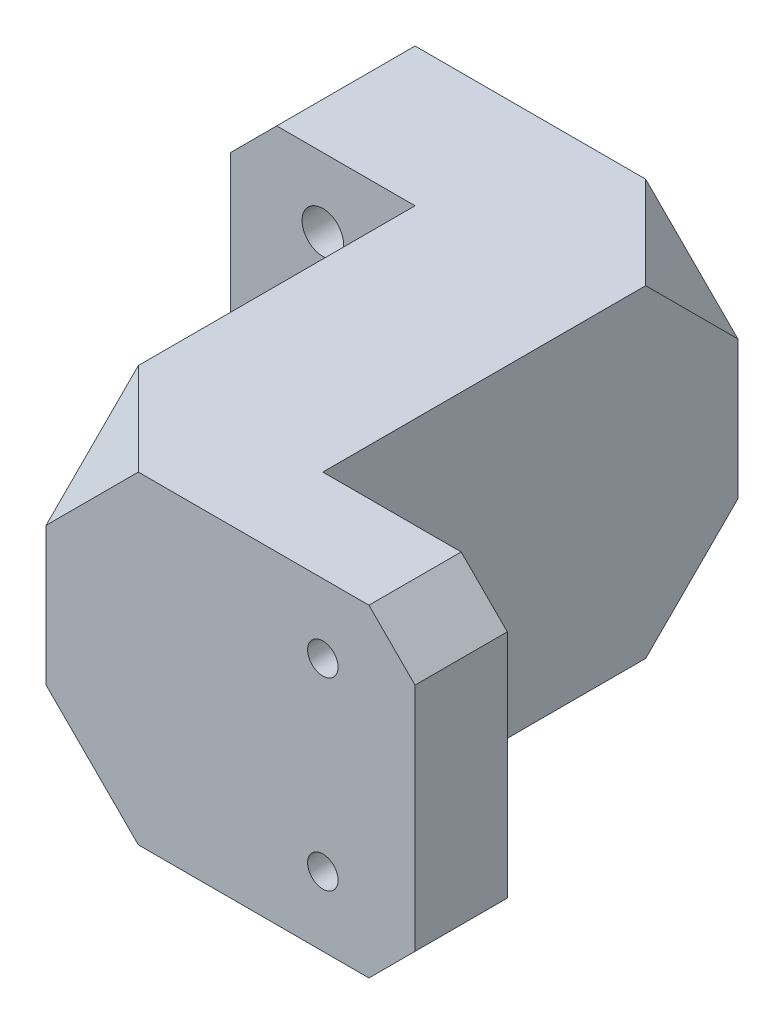
ISO-10303-21;
HEADER;
FILE_DESCRIPTION(('STEP AP214'),'2;1');
FILE_NAME('part.step','',(''),(''),'','','');
FILE_SCHEMA(('AUTOMOTIVE_DESIGN { 1 0 10303 214 1 1 1 1 }'));
ENDSEC;
DATA;
#1=APPLICATION_CONTEXT('core data for automotive mechanical design processes');
#2=APPLICATION_PROTOCOL_DEFINITION('international standard','automotive_design',2000,#1);
#3=PRODUCT_CONTEXT('',#1,'mechanical');
#4=PRODUCT('Part','Part','',(#3));
#5=PRODUCT_RELATED_PRODUCT_CATEGORY('part','',(#4));
#6=PRODUCT_DEFINITION_FORMATION('','',#4);
#7=PRODUCT_DEFINITION_CONTEXT('part definition',#1,'design');
#8=PRODUCT_DEFINITION('design','',#6,#7);
#9=PRODUCT_DEFINITION_SHAPE('','',#8);
#10=(LENGTH_UNIT() NAMED_UNIT(*) SI_UNIT(.MILLI.,.METRE.));
#11=(NAMED_UNIT(*) PLANE_ANGLE_UNIT() SI_UNIT($,.RADIAN.));
#12=(NAMED_UNIT(*) SI_UNIT($,.STERADIAN.) SOLID_ANGLE_UNIT());
#13=UNCERTAINTY_MEASURE_WITH_UNIT(LENGTH_MEASURE(1.E-05),#10,'distance_accuracy_value','');
#14=(GEOMETRIC_REPRESENTATION_CONTEXT(3) GLOBAL_UNCERTAINTY_ASSIGNED_CONTEXT((#13)) GLOBAL_UNIT_ASSIGNED_CONTEXT((#10,
#11,#12)) REPRESENTATION_CONTEXT('',''));
#15=CARTESIAN_POINT('',(0.,0.,0.));
#16=DIRECTION('',(0.,0.,1.));
#17=DIRECTION('',(1.,0.,0.));
#18=AXIS2_PLACEMENT_3D('',#15,#16,#17);
#19=CARTESIAN_POINT('',(0.,17.5,0.));
#20=DIRECTION('',(0.,1.,0.));
#21=DIRECTION('',(0.,0.,1.));
#22=AXIS2_PLACEMENT_3D('',#19,#20,#21);
#23=PLANE('',#22);
#24=DIRECTION('',(0.,0.,-1.));
#25=VECTOR('',#24,1.);
#26=CARTESIAN_POINT('',(-10.,17.5,-12.5));
#27=LINE('',#26,#25);
#28=CARTESIAN_POINT('',(-10.,17.5,17.5));
#29=VERTEX_POINT('',#28);
#30=CARTESIAN_POINT('',(-10.,17.5,-12.5));
#31=VERTEX_POINT('',#30);
#32=EDGE_CURVE('E176',#29,#31,#27,.T.);
#33=ORIENTED_EDGE('',*,*,#32,.F.);
#34=DIRECTION('',(0.707106781186548,0.,0.707106781186548));
#35=VECTOR('',#34,1.);
#36=CARTESIAN_POINT('',(-13.75,17.5,13.75));
#37=LINE('',#36,#35);
#38=CARTESIAN_POINT('',(0.,17.5,27.5));
#39=VERTEX_POINT('',#38);
#40=EDGE_CURVE('E65',#29,#39,#37,.T.);
#41=ORIENTED_EDGE('',*,*,#40,.T.);
#42=DIRECTION('',(1.,0.,0.));
#43=VECTOR('',#42,1.);
#44=CARTESIAN_POINT('',(30.,17.5,27.5));
#45=LINE('',#44,#43);
#46=CARTESIAN_POINT('',(25.,17.5,27.5));
#47=VERTEX_POINT('',#46);
#48=EDGE_CURVE('E173',#39,#47,#45,.T.);
#49=ORIENTED_EDGE('',*,*,#48,.T.);
#50=DIRECTION('',(0.,0.,-1.));
#51=VECTOR('',#50,1.);
#52=CARTESIAN_POINT('',(25.,17.5,17.5));
#53=LINE('',#52,#51);
#54=CARTESIAN_POINT('',(25.,17.5,17.5));
#55=VERTEX_POINT('',#54);
#56=EDGE_CURVE('E248',#47,#55,#53,.T.);
#57=ORIENTED_EDGE('',*,*,#56,.T.);
#58=DIRECTION('',(1.,0.,0.));
#59=VECTOR('',#58,1.);
#60=CARTESIAN_POINT('',(30.,17.5,17.5));
#61=LINE('',#60,#59);
#62=CARTESIAN_POINT('',(10.,17.5,17.5));
#63=VERTEX_POINT('',#62);
#64=EDGE_CURVE('E328',#63,#55,#61,.T.);
#65=ORIENTED_EDGE('',*,*,#64,.F.);
#66=DIRECTION('',(0.,0.,1.));
#67=VECTOR('',#66,1.);
#68=CARTESIAN_POINT('',(9.99999999999999,17.5,-27.5));
#69=LINE('',#68,#67);
#70=CARTESIAN_POINT('',(9.99999999999999,17.5,-17.5));
#71=VERTEX_POINT('',#70);
#72=EDGE_CURVE('E325',#71,#63,#69,.T.);
#73=ORIENTED_EDGE('',*,*,#72,.F.);
#74=DIRECTION('',(-0.707106781186548,0.,-0.707106781186548));
#75=VECTOR('',#74,1.);
#76=CARTESIAN_POINT('',(13.75,17.5,-13.75));
#77=LINE('',#76,#75);
#78=CARTESIAN_POINT('',(0.,17.5,-27.5));
#79=VERTEX_POINT('',#78);
#80=EDGE_CURVE('E73',#71,#79,#77,.T.);
#81=ORIENTED_EDGE('',*,*,#80,.T.);
#82=DIRECTION('',(-1.,0.,0.));
#83=VECTOR('',#82,1.);
#84=CARTESIAN_POINT('',(30.,17.5,-27.5));
#85=LINE('',#84,#83);
#86=CARTESIAN_POINT('',(-25.,17.5,-27.5));
#87=VERTEX_POINT('',#86);
#88=EDGE_CURVE('E185',#79,#87,#85,.T.);
#89=ORIENTED_EDGE('',*,*,#88,.T.);
#90=DIRECTION('',(0.,0.,1.));
#91=VECTOR('',#90,1.);
#92=CARTESIAN_POINT('',(-25.,17.5,-12.5));
#93=LINE('',#92,#91);
#94=CARTESIAN_POINT('',(-25.,17.5,-12.5));
#95=VERTEX_POINT('',#94);
#96=EDGE_CURVE('E251',#87,#95,#93,.T.);
#97=ORIENTED_EDGE('',*,*,#96,.T.);
#98=DIRECTION('',(-1.,0.,0.));
#99=VECTOR('',#98,1.);
#100=CARTESIAN_POINT('',(-30.,17.5,-12.5));
#101=LINE('',#100,#99);
#102=EDGE_CURVE('E320',#31,#95,#101,.T.);
#103=ORIENTED_EDGE('',*,*,#102,.F.);
#104=EDGE_LOOP('',(#33,#41,#49,#57,#65,#73,#81,#89,#97,#103));
#105=FACE_BOUND('',#104,.T.);
#106=ADVANCED_FACE('F48',(#105),#23,.T.);
#107=CARTESIAN_POINT('',(30.,17.5,27.5));
#108=DIRECTION('',(0.,0.,-1.));
#109=DIRECTION('',(-1.,0.,0.));
#110=AXIS2_PLACEMENT_3D('',#107,#108,#109);
#111=PLANE('',#110);
#112=CARTESIAN_POINT('',(20.,-10.,27.5));
#113=DIRECTION('',(0.,0.,-1.));
#114=DIRECTION('',(-1.,0.,0.));
#115=AXIS2_PLACEMENT_3D('',#112,#113,#114);
#116=CIRCLE('',#115,1.65);
#117=CARTESIAN_POINT('',(18.35,-10.,27.5));
#118=VERTEX_POINT('',#117);
#119=EDGE_CURVE('E319',#118,#118,#116,.T.);
#120=ORIENTED_EDGE('',*,*,#119,.T.);
#121=EDGE_LOOP('',(#120));
#122=FACE_BOUND('',#121,.T.);
#123=CARTESIAN_POINT('',(20.,10.,27.5));
#124=DIRECTION('',(0.,0.,-1.));
#125=DIRECTION('',(-1.,0.,0.));
#126=AXIS2_PLACEMENT_3D('',#123,#124,#125);
#127=CIRCLE('',#126,1.65);
#128=CARTESIAN_POINT('',(18.35,10.,27.5));
#129=VERTEX_POINT('',#128);
#130=EDGE_CURVE('E363',#129,#129,#127,.T.);
#131=ORIENTED_EDGE('',*,*,#130,.T.);
#132=EDGE_LOOP('',(#131));
#133=FACE_BOUND('',#132,.T.);
#134=DIRECTION('',(-0.707106781186547,-0.707106781186548,0.));
#135=VECTOR('',#134,1.);
#136=CARTESIAN_POINT('',(-2.50000000000002,15.,27.5));
#137=LINE('',#136,#135);
#138=CARTESIAN_POINT('',(-10.,7.50000000000001,27.5));
#139=VERTEX_POINT('',#138);
#140=EDGE_CURVE('E161',#39,#139,#137,.T.);
#141=ORIENTED_EDGE('',*,*,#140,.T.);
#142=DIRECTION('',(0.,1.,0.));
#143=VECTOR('',#142,1.);
#144=CARTESIAN_POINT('',(-10.,-17.5,27.5));
#145=LINE('',#144,#143);
#146=CARTESIAN_POINT('',(-10.,-7.50000000000001,27.5));
#147=VERTEX_POINT('',#146);
#148=EDGE_CURVE('E301',#147,#139,#145,.T.);
#149=ORIENTED_EDGE('',*,*,#148,.F.);
#150=DIRECTION('',(-0.707106781186547,0.707106781186548,0.));
#151=VECTOR('',#150,1.);
#152=CARTESIAN_POINT('',(-2.50000000000002,-15.,27.5));
#153=LINE('',#152,#151);
#154=CARTESIAN_POINT('',(0.,-17.5,27.5));
#155=VERTEX_POINT('',#154);
#156=EDGE_CURVE('E285',#155,#147,#153,.T.);
#157=ORIENTED_EDGE('',*,*,#156,.F.);
#158=DIRECTION('',(1.,0.,0.));
#159=VECTOR('',#158,1.);
#160=CARTESIAN_POINT('',(30.,-17.5,27.5));
#161=LINE('',#160,#159);
#162=CARTESIAN_POINT('',(25.,-17.5,27.5));
#163=VERTEX_POINT('',#162);
#164=EDGE_CURVE('E192',#155,#163,#161,.T.);
#165=ORIENTED_EDGE('',*,*,#164,.T.);
#166=DIRECTION('',(-0.707106781186549,-0.707106781186546,0.));
#167=VECTOR('',#166,1.);
#168=CARTESIAN_POINT('',(30.,-12.5,27.5));
#169=LINE('',#168,#167);
#170=CARTESIAN_POINT('',(30.,-12.5,27.5));
#171=VERTEX_POINT('',#170);
#172=EDGE_CURVE('E270',#163,#171,#169,.F.);
#173=ORIENTED_EDGE('',*,*,#172,.T.);
#174=DIRECTION('',(0.,-1.,0.));
#175=VECTOR('',#174,1.);
#176=CARTESIAN_POINT('',(30.,17.5,27.5));
#177=LINE('',#176,#175);
#178=CARTESIAN_POINT('',(30.,12.5,27.5));
#179=VERTEX_POINT('',#178);
#180=EDGE_CURVE('E204',#179,#171,#177,.T.);
#181=ORIENTED_EDGE('',*,*,#180,.F.);
#182=DIRECTION('',(-0.707106781186547,0.707106781186549,0.));
#183=VECTOR('',#182,1.);
#184=CARTESIAN_POINT('',(25.,17.5,27.5));
#185=LINE('',#184,#183);
#186=EDGE_CURVE('E182',#179,#47,#185,.T.);
#187=ORIENTED_EDGE('',*,*,#186,.T.);
#188=ORIENTED_EDGE('',*,*,#48,.F.);
#189=EDGE_LOOP('',(#141,#149,#157,#165,#173,#181,#187,#188));
#190=FACE_BOUND('',#189,.T.);
#191=ADVANCED_FACE('F179',(#122,#133,#190),#111,.F.);
#192=CARTESIAN_POINT('',(-10.,-17.5,-12.5));
#193=DIRECTION('',(1.,0.,0.));
#194=DIRECTION('',(0.,0.,-1.));
#195=AXIS2_PLACEMENT_3D('',#192,#193,#194);
#196=PLANE('',#195);
#197=DIRECTION('',(0.,0.707106781186548,-0.707106781186547));
#198=VECTOR('',#197,1.);
#199=CARTESIAN_POINT('',(-10.,32.5,2.5));
#200=LINE('',#199,#198);
#201=EDGE_CURVE('E163',#139,#29,#200,.T.);
#202=ORIENTED_EDGE('',*,*,#201,.T.);
#203=ORIENTED_EDGE('',*,*,#32,.T.);
#204=DIRECTION('',(0.,1.,0.));
#205=VECTOR('',#204,1.);
#206=CARTESIAN_POINT('',(-10.,-17.5,-12.5));
#207=LINE('',#206,#205);
#208=CARTESIAN_POINT('',(-10.,-17.5,-12.5));
#209=VERTEX_POINT('',#208);
#210=EDGE_CURVE('E305',#209,#31,#207,.T.);
#211=ORIENTED_EDGE('',*,*,#210,.F.);
#212=DIRECTION('',(0.,0.,-1.));
#213=VECTOR('',#212,1.);
#214=CARTESIAN_POINT('',(-10.,-17.5,-12.5));
#215=LINE('',#214,#213);
#216=CARTESIAN_POINT('',(-10.,-17.5,17.5));
#217=VERTEX_POINT('',#216);
#218=EDGE_CURVE('E195',#217,#209,#215,.T.);
#219=ORIENTED_EDGE('',*,*,#218,.F.);
#220=DIRECTION('',(0.,-0.707106781186548,-0.707106781186547));
#221=VECTOR('',#220,1.);
#222=CARTESIAN_POINT('',(-10.,-32.5,2.5));
#223=LINE('',#222,#221);
#224=EDGE_CURVE('E11',#147,#217,#223,.T.);
#225=ORIENTED_EDGE('',*,*,#224,.F.);
#226=ORIENTED_EDGE('',*,*,#148,.T.);
#227=EDGE_LOOP('',(#202,#203,#211,#219,#225,#226));
#228=FACE_BOUND('',#227,.T.);
#229=ADVANCED_FACE('F401',(#228),#196,.F.);
#230=CARTESIAN_POINT('',(30.,17.5,-27.5));
#231=DIRECTION('',(0.,0.,1.));
#232=DIRECTION('',(1.,0.,0.));
#233=AXIS2_PLACEMENT_3D('',#230,#231,#232);
#234=PLANE('',#233);
#235=CARTESIAN_POINT('',(-20.,-10.,-27.5));
#236=DIRECTION('',(0.,0.,-1.));
#237=DIRECTION('',(-1.,0.,0.));
#238=AXIS2_PLACEMENT_3D('',#235,#236,#237);
#239=CIRCLE('',#238,4.);
#240=CARTESIAN_POINT('',(-24.,-10.,-27.5));
#241=VERTEX_POINT('',#240);
#242=EDGE_CURVE('E219',#241,#241,#239,.T.);
#243=ORIENTED_EDGE('',*,*,#242,.F.);
#244=EDGE_LOOP('',(#243));
#245=FACE_BOUND('',#244,.T.);
#246=CARTESIAN_POINT('',(-20.,10.,-27.5));
#247=DIRECTION('',(0.,0.,-1.));
#248=DIRECTION('',(-1.,0.,0.));
#249=AXIS2_PLACEMENT_3D('',#246,#247,#248);
#250=CIRCLE('',#249,4.);
#251=CARTESIAN_POINT('',(-24.,10.,-27.5));
#252=VERTEX_POINT('',#251);
#253=EDGE_CURVE('E387',#252,#252,#250,.T.);
#254=ORIENTED_EDGE('',*,*,#253,.F.);
#255=EDGE_LOOP('',(#254));
#256=FACE_BOUND('',#255,.T.);
#257=DIRECTION('',(0.707106781186547,-0.707106781186548,0.));
#258=VECTOR('',#257,1.);
#259=CARTESIAN_POINT('',(32.5,-15.,-27.5));
#260=LINE('',#259,#258);
#261=CARTESIAN_POINT('',(9.99999999999999,7.5,-27.5));
#262=VERTEX_POINT('',#261);
#263=EDGE_CURVE('E394',#79,#262,#260,.T.);
#264=ORIENTED_EDGE('',*,*,#263,.T.);
#265=DIRECTION('',(0.,1.,0.));
#266=VECTOR('',#265,1.);
#267=CARTESIAN_POINT('',(9.99999999999999,-17.5,-27.5));
#268=LINE('',#267,#266);
#269=CARTESIAN_POINT('',(9.99999999999999,-7.5,-27.5));
#270=VERTEX_POINT('',#269);
#271=EDGE_CURVE('E313',#270,#262,#268,.T.);
#272=ORIENTED_EDGE('',*,*,#271,.F.);
#273=DIRECTION('',(0.707106781186547,0.707106781186548,0.));
#274=VECTOR('',#273,1.);
#275=CARTESIAN_POINT('',(32.5,15.,-27.5));
#276=LINE('',#275,#274);
#277=CARTESIAN_POINT('',(0.,-17.5,-27.5));
#278=VERTEX_POINT('',#277);
#279=EDGE_CURVE('E273',#278,#270,#276,.T.);
#280=ORIENTED_EDGE('',*,*,#279,.F.);
#281=DIRECTION('',(-1.,0.,0.));
#282=VECTOR('',#281,1.);
#283=CARTESIAN_POINT('',(30.,-17.5,-27.5));
#284=LINE('',#283,#282);
#285=CARTESIAN_POINT('',(-25.,-17.5,-27.5));
#286=VERTEX_POINT('',#285);
#287=EDGE_CURVE('E186',#278,#286,#284,.T.);
#288=ORIENTED_EDGE('',*,*,#287,.T.);
#289=DIRECTION('',(0.707106781186549,-0.707106781186546,0.));
#290=VECTOR('',#289,1.);
#291=CARTESIAN_POINT('',(-30.,-12.5,-27.5));
#292=LINE('',#291,#290);
#293=CARTESIAN_POINT('',(-30.,-12.5,-27.5));
#294=VERTEX_POINT('',#293);
#295=EDGE_CURVE('E245',#286,#294,#292,.F.);
#296=ORIENTED_EDGE('',*,*,#295,.T.);
#297=DIRECTION('',(0.,-1.,0.));
#298=VECTOR('',#297,1.);
#299=CARTESIAN_POINT('',(-30.,17.5,-27.5));
#300=LINE('',#299,#298);
#301=CARTESIAN_POINT('',(-30.,12.5,-27.5));
#302=VERTEX_POINT('',#301);
#303=EDGE_CURVE('E190',#302,#294,#300,.T.);
#304=ORIENTED_EDGE('',*,*,#303,.F.);
#305=DIRECTION('',(0.707106781186547,0.707106781186549,0.));
#306=VECTOR('',#305,1.);
#307=CARTESIAN_POINT('',(-25.,17.5,-27.5));
#308=LINE('',#307,#306);
#309=EDGE_CURVE('E241',#302,#87,#308,.T.);
#310=ORIENTED_EDGE('',*,*,#309,.T.);
#311=ORIENTED_EDGE('',*,*,#88,.F.);
#312=EDGE_LOOP('',(#264,#272,#280,#288,#296,#304,#310,#311));
#313=FACE_BOUND('',#312,.T.);
#314=ADVANCED_FACE('F403',(#245,#256,#313),#234,.F.);
#315=CARTESIAN_POINT('',(9.99999999999999,-17.5,-27.5));
#316=DIRECTION('',(-1.,0.,0.));
#317=DIRECTION('',(0.,0.,1.));
#318=AXIS2_PLACEMENT_3D('',#315,#316,#317);
#319=PLANE('',#318);
#320=DIRECTION('',(0.,0.707106781186547,0.707106781186547));
#321=VECTOR('',#320,1.);
#322=CARTESIAN_POINT('',(9.99999999999999,12.5,-22.5));
#323=LINE('',#322,#321);
#324=EDGE_CURVE('E391',#262,#71,#323,.T.);
#325=ORIENTED_EDGE('',*,*,#324,.T.);
#326=ORIENTED_EDGE('',*,*,#72,.T.);
#327=DIRECTION('',(0.,1.,0.));
#328=VECTOR('',#327,1.);
#329=CARTESIAN_POINT('',(10.,-17.5,17.5));
#330=LINE('',#329,#328);
#331=CARTESIAN_POINT('',(10.,-17.5,17.5));
#332=VERTEX_POINT('',#331);
#333=EDGE_CURVE('E344',#332,#63,#330,.T.);
#334=ORIENTED_EDGE('',*,*,#333,.F.);
#335=DIRECTION('',(0.,0.,1.));
#336=VECTOR('',#335,1.);
#337=CARTESIAN_POINT('',(9.99999999999999,-17.5,-27.5));
#338=LINE('',#337,#336);
#339=CARTESIAN_POINT('',(9.99999999999999,-17.5,-17.5));
#340=VERTEX_POINT('',#339);
#341=EDGE_CURVE('E336',#340,#332,#338,.T.);
#342=ORIENTED_EDGE('',*,*,#341,.F.);
#343=DIRECTION('',(0.,-0.707106781186547,0.707106781186547));
#344=VECTOR('',#343,1.);
#345=CARTESIAN_POINT('',(9.99999999999999,-12.5,-22.5));
#346=LINE('',#345,#344);
#347=EDGE_CURVE('E281',#270,#340,#346,.T.);
#348=ORIENTED_EDGE('',*,*,#347,.F.);
#349=ORIENTED_EDGE('',*,*,#271,.T.);
#350=EDGE_LOOP('',(#325,#326,#334,#342,#348,#349));
#351=FACE_BOUND('',#350,.T.);
#352=ADVANCED_FACE('F409',(#351),#319,.F.);
#353=CARTESIAN_POINT('',(-30.,17.5,27.5));
#354=DIRECTION('',(1.,0.,0.));
#355=DIRECTION('',(0.,0.,-1.));
#356=AXIS2_PLACEMENT_3D('',#353,#354,#355);
#357=PLANE('',#356);
#358=ORIENTED_EDGE('',*,*,#303,.T.);
#359=DIRECTION('',(0.,0.,1.));
#360=VECTOR('',#359,1.);
#361=CARTESIAN_POINT('',(-30.,-12.5,27.5));
#362=LINE('',#361,#360);
#363=CARTESIAN_POINT('',(-30.,-12.5,-12.5));
#364=VERTEX_POINT('',#363);
#365=EDGE_CURVE('E223',#294,#364,#362,.T.);
#366=ORIENTED_EDGE('',*,*,#365,.T.);
#367=DIRECTION('',(0.,1.,0.));
#368=VECTOR('',#367,1.);
#369=CARTESIAN_POINT('',(-30.,-17.5,-12.5));
#370=LINE('',#369,#368);
#371=CARTESIAN_POINT('',(-30.,12.5,-12.5));
#372=VERTEX_POINT('',#371);
#373=EDGE_CURVE('E310',#364,#372,#370,.T.);
#374=ORIENTED_EDGE('',*,*,#373,.T.);
#375=DIRECTION('',(0.,0.,-1.));
#376=VECTOR('',#375,1.);
#377=CARTESIAN_POINT('',(-30.,12.5,-27.5));
#378=LINE('',#377,#376);
#379=EDGE_CURVE('E208',#372,#302,#378,.T.);
#380=ORIENTED_EDGE('',*,*,#379,.T.);
#381=EDGE_LOOP('',(#358,#366,#374,#380));
#382=FACE_BOUND('',#381,.T.);
#383=ADVANCED_FACE('F426',(#382),#357,.F.);
#384=CARTESIAN_POINT('',(30.,17.5,27.5));
#385=DIRECTION('',(-1.,0.,0.));
#386=DIRECTION('',(0.,0.,1.));
#387=AXIS2_PLACEMENT_3D('',#384,#385,#386);
#388=PLANE('',#387);
#389=ORIENTED_EDGE('',*,*,#180,.T.);
#390=DIRECTION('',(0.,0.,-1.));
#391=VECTOR('',#390,1.);
#392=CARTESIAN_POINT('',(30.,-12.5,27.5));
#393=LINE('',#392,#391);
#394=CARTESIAN_POINT('',(30.,-12.5,17.5));
#395=VERTEX_POINT('',#394);
#396=EDGE_CURVE('E258',#171,#395,#393,.T.);
#397=ORIENTED_EDGE('',*,*,#396,.T.);
#398=DIRECTION('',(0.,1.,0.));
#399=VECTOR('',#398,1.);
#400=CARTESIAN_POINT('',(30.,-17.5,17.5));
#401=LINE('',#400,#399);
#402=CARTESIAN_POINT('',(30.,12.5,17.5));
#403=VERTEX_POINT('',#402);
#404=EDGE_CURVE('E199',#395,#403,#401,.T.);
#405=ORIENTED_EDGE('',*,*,#404,.T.);
#406=DIRECTION('',(0.,0.,1.));
#407=VECTOR('',#406,1.);
#408=CARTESIAN_POINT('',(30.,12.5,27.5));
#409=LINE('',#408,#407);
#410=EDGE_CURVE('E255',#403,#179,#409,.T.);
#411=ORIENTED_EDGE('',*,*,#410,.T.);
#412=EDGE_LOOP('',(#389,#397,#405,#411));
#413=FACE_BOUND('',#412,.T.);
#414=ADVANCED_FACE('F423',(#413),#388,.F.);
#415=CARTESIAN_POINT('',(0.,-17.5,0.));
#416=DIRECTION('',(0.,1.,0.));
#417=DIRECTION('',(0.,0.,1.));
#418=AXIS2_PLACEMENT_3D('',#415,#416,#417);
#419=PLANE('',#418);
#420=DIRECTION('',(0.707106781186548,0.,0.707106781186548));
#421=VECTOR('',#420,1.);
#422=CARTESIAN_POINT('',(-13.75,-17.5,13.75));
#423=LINE('',#422,#421);
#424=EDGE_CURVE('E58',#217,#155,#423,.T.);
#425=ORIENTED_EDGE('',*,*,#424,.F.);
#426=ORIENTED_EDGE('',*,*,#218,.T.);
#427=DIRECTION('',(-1.,0.,0.));
#428=VECTOR('',#427,1.);
#429=CARTESIAN_POINT('',(-30.,-17.5,-12.5));
#430=LINE('',#429,#428);
#431=CARTESIAN_POINT('',(-25.,-17.5,-12.5));
#432=VERTEX_POINT('',#431);
#433=EDGE_CURVE('E304',#209,#432,#430,.T.);
#434=ORIENTED_EDGE('',*,*,#433,.T.);
#435=DIRECTION('',(0.,0.,-1.));
#436=VECTOR('',#435,1.);
#437=CARTESIAN_POINT('',(-25.,-17.5,0.));
#438=LINE('',#437,#436);
#439=EDGE_CURVE('E237',#432,#286,#438,.T.);
#440=ORIENTED_EDGE('',*,*,#439,.T.);
#441=ORIENTED_EDGE('',*,*,#287,.F.);
#442=DIRECTION('',(-0.707106781186548,0.,-0.707106781186548));
#443=VECTOR('',#442,1.);
#444=CARTESIAN_POINT('',(13.75,-17.5,-13.75));
#445=LINE('',#444,#443);
#446=EDGE_CURVE('E277',#340,#278,#445,.T.);
#447=ORIENTED_EDGE('',*,*,#446,.F.);
#448=ORIENTED_EDGE('',*,*,#341,.T.);
#449=DIRECTION('',(1.,0.,0.));
#450=VECTOR('',#449,1.);
#451=CARTESIAN_POINT('',(30.,-17.5,17.5));
#452=LINE('',#451,#450);
#453=CARTESIAN_POINT('',(25.,-17.5,17.5));
#454=VERTEX_POINT('',#453);
#455=EDGE_CURVE('E339',#332,#454,#452,.T.);
#456=ORIENTED_EDGE('',*,*,#455,.T.);
#457=DIRECTION('',(0.,0.,1.));
#458=VECTOR('',#457,1.);
#459=CARTESIAN_POINT('',(25.,-17.5,0.));
#460=LINE('',#459,#458);
#461=EDGE_CURVE('E233',#454,#163,#460,.T.);
#462=ORIENTED_EDGE('',*,*,#461,.T.);
#463=ORIENTED_EDGE('',*,*,#164,.F.);
#464=EDGE_LOOP('',(#425,#426,#434,#440,#441,#447,#448,#456,#462,#463));
#465=FACE_BOUND('',#464,.T.);
#466=ADVANCED_FACE('F295',(#465),#419,.F.);
#467=CARTESIAN_POINT('',(-30.,-17.5,-12.5));
#468=DIRECTION('',(0.,0.,-1.));
#469=DIRECTION('',(-1.,0.,0.));
#470=AXIS2_PLACEMENT_3D('',#467,#468,#469);
#471=PLANE('',#470);
#472=CARTESIAN_POINT('',(-20.,10.,-12.5));
#473=DIRECTION('',(0.,0.,-1.));
#474=DIRECTION('',(-1.,0.,0.));
#475=AXIS2_PLACEMENT_3D('',#472,#473,#474);
#476=CIRCLE('',#475,2.25);
#477=CARTESIAN_POINT('',(-22.25,10.,-12.5));
#478=VERTEX_POINT('',#477);
#479=EDGE_CURVE('E215',#478,#478,#476,.T.);
#480=ORIENTED_EDGE('',*,*,#479,.T.);
#481=EDGE_LOOP('',(#480));
#482=FACE_BOUND('',#481,.T.);
#483=CARTESIAN_POINT('',(-20.,-10.,-12.5));
#484=DIRECTION('',(0.,0.,-1.));
#485=DIRECTION('',(-1.,0.,0.));
#486=AXIS2_PLACEMENT_3D('',#483,#484,#485);
#487=CIRCLE('',#486,2.25);
#488=CARTESIAN_POINT('',(-22.25,-10.,-12.5));
#489=VERTEX_POINT('',#488);
#490=EDGE_CURVE('E209',#489,#489,#487,.T.);
#491=ORIENTED_EDGE('',*,*,#490,.T.);
#492=EDGE_LOOP('',(#491));
#493=FACE_BOUND('',#492,.T.);
#494=ORIENTED_EDGE('',*,*,#373,.F.);
#495=DIRECTION('',(-0.707106781186549,0.707106781186546,0.));
#496=VECTOR('',#495,1.);
#497=CARTESIAN_POINT('',(-30.,-12.5,-12.5));
#498=LINE('',#497,#496);
#499=EDGE_CURVE('E230',#364,#432,#498,.F.);
#500=ORIENTED_EDGE('',*,*,#499,.T.);
#501=ORIENTED_EDGE('',*,*,#433,.F.);
#502=ORIENTED_EDGE('',*,*,#210,.T.);
#503=ORIENTED_EDGE('',*,*,#102,.T.);
#504=DIRECTION('',(-0.707106781186547,-0.707106781186549,0.));
#505=VECTOR('',#504,1.);
#506=CARTESIAN_POINT('',(-25.,17.5,-12.5));
#507=LINE('',#506,#505);
#508=EDGE_CURVE('E227',#95,#372,#507,.T.);
#509=ORIENTED_EDGE('',*,*,#508,.T.);
#510=EDGE_LOOP('',(#494,#500,#501,#502,#503,#509));
#511=FACE_BOUND('',#510,.T.);
#512=ADVANCED_FACE('F421',(#482,#493,#511),#471,.F.);
#513=CARTESIAN_POINT('',(30.,-17.5,17.5));
#514=DIRECTION('',(0.,0.,1.));
#515=DIRECTION('',(1.,0.,0.));
#516=AXIS2_PLACEMENT_3D('',#513,#514,#515);
#517=PLANE('',#516);
#518=CARTESIAN_POINT('',(20.,10.,17.5));
#519=DIRECTION('',(0.,0.,-1.));
#520=DIRECTION('',(-1.,0.,0.));
#521=AXIS2_PLACEMENT_3D('',#518,#519,#520);
#522=CIRCLE('',#521,1.65);
#523=CARTESIAN_POINT('',(18.35,10.,17.5));
#524=VERTEX_POINT('',#523);
#525=EDGE_CURVE('E213',#524,#524,#522,.T.);
#526=ORIENTED_EDGE('',*,*,#525,.F.);
#527=EDGE_LOOP('',(#526));
#528=FACE_BOUND('',#527,.T.);
#529=CARTESIAN_POINT('',(20.,-10.,17.5));
#530=DIRECTION('',(0.,0.,-1.));
#531=DIRECTION('',(-1.,0.,0.));
#532=AXIS2_PLACEMENT_3D('',#529,#530,#531);
#533=CIRCLE('',#532,1.65);
#534=CARTESIAN_POINT('',(18.35,-10.,17.5));
#535=VERTEX_POINT('',#534);
#536=EDGE_CURVE('E359',#535,#535,#533,.T.);
#537=ORIENTED_EDGE('',*,*,#536,.F.);
#538=EDGE_LOOP('',(#537));
#539=FACE_BOUND('',#538,.T.);
#540=ORIENTED_EDGE('',*,*,#404,.F.);
#541=DIRECTION('',(0.707106781186549,0.707106781186546,0.));
#542=VECTOR('',#541,1.);
#543=CARTESIAN_POINT('',(30.,-12.5,17.5));
#544=LINE('',#543,#542);
#545=EDGE_CURVE('E265',#395,#454,#544,.F.);
#546=ORIENTED_EDGE('',*,*,#545,.T.);
#547=ORIENTED_EDGE('',*,*,#455,.F.);
#548=ORIENTED_EDGE('',*,*,#333,.T.);
#549=ORIENTED_EDGE('',*,*,#64,.T.);
#550=DIRECTION('',(0.707106781186547,-0.707106781186549,0.));
#551=VECTOR('',#550,1.);
#552=CARTESIAN_POINT('',(25.,17.5,17.5));
#553=LINE('',#552,#551);
#554=EDGE_CURVE('E262',#55,#403,#553,.T.);
#555=ORIENTED_EDGE('',*,*,#554,.T.);
#556=EDGE_LOOP('',(#540,#546,#547,#548,#549,#555));
#557=FACE_BOUND('',#556,.T.);
#558=ADVANCED_FACE('F460',(#528,#539,#557),#517,.F.);
#559=CARTESIAN_POINT('',(20.,-10.,17.5));
#560=DIRECTION('',(0.,0.,-1.));
#561=DIRECTION('',(-1.,0.,0.));
#562=AXIS2_PLACEMENT_3D('',#559,#560,#561);
#563=CYLINDRICAL_SURFACE('',#562,1.65);
#564=ORIENTED_EDGE('',*,*,#119,.F.);
#565=EDGE_LOOP('',(#564));
#566=FACE_BOUND('',#565,.T.);
#567=ORIENTED_EDGE('',*,*,#536,.T.);
#568=EDGE_LOOP('',(#567));
#569=FACE_BOUND('',#568,.T.);
#570=ADVANCED_FACE('F481',(#566,#569),#563,.F.);
#571=CARTESIAN_POINT('',(20.,10.,17.5));
#572=DIRECTION('',(0.,0.,-1.));
#573=DIRECTION('',(-1.,0.,0.));
#574=AXIS2_PLACEMENT_3D('',#571,#572,#573);
#575=CYLINDRICAL_SURFACE('',#574,1.65);
#576=ORIENTED_EDGE('',*,*,#130,.F.);
#577=EDGE_LOOP('',(#576));
#578=FACE_BOUND('',#577,.T.);
#579=ORIENTED_EDGE('',*,*,#525,.T.);
#580=EDGE_LOOP('',(#579));
#581=FACE_BOUND('',#580,.T.);
#582=ADVANCED_FACE('F485',(#578,#581),#575,.F.);
#583=CARTESIAN_POINT('',(-20.,-10.,-27.5));
#584=DIRECTION('',(0.,0.,-1.));
#585=DIRECTION('',(-1.,0.,0.));
#586=AXIS2_PLACEMENT_3D('',#583,#584,#585);
#587=CYLINDRICAL_SURFACE('',#586,2.25);
#588=CARTESIAN_POINT('',(-20.,-10.,-22.9));
#589=DIRECTION('',(0.,0.,-1.));
#590=DIRECTION('',(-1.,0.,0.));
#591=AXIS2_PLACEMENT_3D('',#588,#589,#590);
#592=CIRCLE('',#591,2.25000000000001);
#593=CARTESIAN_POINT('',(-22.25,-10.,-22.9));
#594=VERTEX_POINT('',#593);
#595=EDGE_CURVE('E214',#594,#594,#592,.T.);
#596=ORIENTED_EDGE('',*,*,#595,.T.);
#597=EDGE_LOOP('',(#596));
#598=FACE_BOUND('',#597,.T.);
#599=ORIENTED_EDGE('',*,*,#490,.F.);
#600=EDGE_LOOP('',(#599));
#601=FACE_BOUND('',#600,.T.);
#602=ADVANCED_FACE('F489',(#598,#601),#587,.F.);
#603=CARTESIAN_POINT('',(-17.75,-10.,-22.9));
#604=DIRECTION('',(0.,0.,1.));
#605=DIRECTION('',(1.,0.,0.));
#606=AXIS2_PLACEMENT_3D('',#603,#604,#605);
#607=PLANE('',#606);
#608=ORIENTED_EDGE('',*,*,#595,.F.);
#609=EDGE_LOOP('',(#608));
#610=FACE_BOUND('',#609,.T.);
#611=CARTESIAN_POINT('',(-20.,-10.,-22.9));
#612=DIRECTION('',(0.,0.,-1.));
#613=DIRECTION('',(-1.,0.,0.));
#614=AXIS2_PLACEMENT_3D('',#611,#612,#613);
#615=CIRCLE('',#614,4.);
#616=CARTESIAN_POINT('',(-24.,-10.,-22.9));
#617=VERTEX_POINT('',#616);
#618=EDGE_CURVE('E373',#617,#617,#615,.T.);
#619=ORIENTED_EDGE('',*,*,#618,.T.);
#620=EDGE_LOOP('',(#619));
#621=FACE_BOUND('',#620,.T.);
#622=ADVANCED_FACE('F493',(#610,#621),#607,.F.);
#623=CARTESIAN_POINT('',(-20.,-10.,-27.5));
#624=DIRECTION('',(0.,0.,-1.));
#625=DIRECTION('',(-1.,0.,0.));
#626=AXIS2_PLACEMENT_3D('',#623,#624,#625);
#627=CYLINDRICAL_SURFACE('',#626,4.);
#628=ORIENTED_EDGE('',*,*,#618,.F.);
#629=EDGE_LOOP('',(#628));
#630=FACE_BOUND('',#629,.T.);
#631=ORIENTED_EDGE('',*,*,#242,.T.);
#632=EDGE_LOOP('',(#631));
#633=FACE_BOUND('',#632,.T.);
#634=ADVANCED_FACE('F497',(#630,#633),#627,.F.);
#635=CARTESIAN_POINT('',(-20.,10.,-27.5));
#636=DIRECTION('',(0.,0.,-1.));
#637=DIRECTION('',(-1.,0.,0.));
#638=AXIS2_PLACEMENT_3D('',#635,#636,#637);
#639=CYLINDRICAL_SURFACE('',#638,2.25);
#640=CARTESIAN_POINT('',(-20.,10.,-22.9));
#641=DIRECTION('',(0.,0.,-1.));
#642=DIRECTION('',(-1.,0.,0.));
#643=AXIS2_PLACEMENT_3D('',#640,#641,#642);
#644=CIRCLE('',#643,2.25000000000001);
#645=CARTESIAN_POINT('',(-22.25,10.,-22.9));
#646=VERTEX_POINT('',#645);
#647=EDGE_CURVE('E220',#646,#646,#644,.T.);
#648=ORIENTED_EDGE('',*,*,#647,.T.);
#649=EDGE_LOOP('',(#648));
#650=FACE_BOUND('',#649,.T.);
#651=ORIENTED_EDGE('',*,*,#479,.F.);
#652=EDGE_LOOP('',(#651));
#653=FACE_BOUND('',#652,.T.);
#654=ADVANCED_FACE('F501',(#650,#653),#639,.F.);
#655=CARTESIAN_POINT('',(-17.75,10.,-22.9));
#656=DIRECTION('',(0.,0.,1.));
#657=DIRECTION('',(1.,0.,0.));
#658=AXIS2_PLACEMENT_3D('',#655,#656,#657);
#659=PLANE('',#658);
#660=ORIENTED_EDGE('',*,*,#647,.F.);
#661=EDGE_LOOP('',(#660));
#662=FACE_BOUND('',#661,.T.);
#663=CARTESIAN_POINT('',(-20.,10.,-22.9));
#664=DIRECTION('',(0.,0.,-1.));
#665=DIRECTION('',(-1.,0.,0.));
#666=AXIS2_PLACEMENT_3D('',#663,#664,#665);
#667=CIRCLE('',#666,4.);
#668=CARTESIAN_POINT('',(-24.,10.,-22.9));
#669=VERTEX_POINT('',#668);
#670=EDGE_CURVE('E383',#669,#669,#667,.T.);
#671=ORIENTED_EDGE('',*,*,#670,.T.);
#672=EDGE_LOOP('',(#671));
#673=FACE_BOUND('',#672,.T.);
#674=ADVANCED_FACE('F505',(#662,#673),#659,.F.);
#675=CARTESIAN_POINT('',(-20.,10.,-27.5));
#676=DIRECTION('',(0.,0.,-1.));
#677=DIRECTION('',(-1.,0.,0.));
#678=AXIS2_PLACEMENT_3D('',#675,#676,#677);
#679=CYLINDRICAL_SURFACE('',#678,4.);
#680=ORIENTED_EDGE('',*,*,#670,.F.);
#681=EDGE_LOOP('',(#680));
#682=FACE_BOUND('',#681,.T.);
#683=ORIENTED_EDGE('',*,*,#253,.T.);
#684=EDGE_LOOP('',(#683));
#685=FACE_BOUND('',#684,.T.);
#686=ADVANCED_FACE('F440',(#682,#685),#679,.F.);
#687=CARTESIAN_POINT('',(-30.,-12.5,27.5));
#688=DIRECTION('',(0.707106781186545,0.707106781186549,0.));
#689=DIRECTION('',(0.,0.,1.));
#690=AXIS2_PLACEMENT_3D('',#687,#688,#689);
#691=PLANE('',#690);
#692=ORIENTED_EDGE('',*,*,#295,.F.);
#693=ORIENTED_EDGE('',*,*,#439,.F.);
#694=ORIENTED_EDGE('',*,*,#499,.F.);
#695=ORIENTED_EDGE('',*,*,#365,.F.);
#696=EDGE_LOOP('',(#692,#693,#694,#695));
#697=FACE_BOUND('',#696,.T.);
#698=ADVANCED_FACE('F433',(#697),#691,.F.);
#699=CARTESIAN_POINT('',(-25.,17.5,0.));
#700=DIRECTION('',(-0.707106781186548,0.707106781186546,0.));
#701=DIRECTION('',(0.,0.,-1.));
#702=AXIS2_PLACEMENT_3D('',#699,#700,#701);
#703=PLANE('',#702);
#704=ORIENTED_EDGE('',*,*,#309,.F.);
#705=ORIENTED_EDGE('',*,*,#379,.F.);
#706=ORIENTED_EDGE('',*,*,#508,.F.);
#707=ORIENTED_EDGE('',*,*,#96,.F.);
#708=EDGE_LOOP('',(#704,#705,#706,#707));
#709=FACE_BOUND('',#708,.T.);
#710=ADVANCED_FACE('F439',(#709),#703,.T.);
#711=CARTESIAN_POINT('',(30.,-12.5,27.5));
#712=DIRECTION('',(-0.707106781186545,0.707106781186549,0.));
#713=DIRECTION('',(0.,0.,-1.));
#714=AXIS2_PLACEMENT_3D('',#711,#712,#713);
#715=PLANE('',#714);
#716=ORIENTED_EDGE('',*,*,#172,.F.);
#717=ORIENTED_EDGE('',*,*,#461,.F.);
#718=ORIENTED_EDGE('',*,*,#545,.F.);
#719=ORIENTED_EDGE('',*,*,#396,.F.);
#720=EDGE_LOOP('',(#716,#717,#718,#719));
#721=FACE_BOUND('',#720,.T.);
#722=ADVANCED_FACE('F446',(#721),#715,.F.);
#723=CARTESIAN_POINT('',(25.,17.5,0.));
#724=DIRECTION('',(0.707106781186548,0.707106781186546,0.));
#725=DIRECTION('',(0.,0.,1.));
#726=AXIS2_PLACEMENT_3D('',#723,#724,#725);
#727=PLANE('',#726);
#728=ORIENTED_EDGE('',*,*,#186,.F.);
#729=ORIENTED_EDGE('',*,*,#410,.F.);
#730=ORIENTED_EDGE('',*,*,#554,.F.);
#731=ORIENTED_EDGE('',*,*,#56,.F.);
#732=EDGE_LOOP('',(#728,#729,#730,#731));
#733=FACE_BOUND('',#732,.T.);
#734=ADVANCED_FACE('F51',(#733),#727,.T.);
#735=CARTESIAN_POINT('',(15.,-15.,-15.));
#736=DIRECTION('',(0.577350269189626,-0.577350269189626,-0.577350269189626));
#737=DIRECTION('',(-0.707106781186548,0.,-0.707106781186548));
#738=AXIS2_PLACEMENT_3D('',#735,#736,#737);
#739=PLANE('',#738);
#740=ORIENTED_EDGE('',*,*,#446,.T.);
#741=ORIENTED_EDGE('',*,*,#279,.T.);
#742=ORIENTED_EDGE('',*,*,#347,.T.);
#743=EDGE_LOOP('',(#740,#741,#742));
#744=FACE_BOUND('',#743,.T.);
#745=ADVANCED_FACE('F455',(#744),#739,.T.);
#746=CARTESIAN_POINT('',(-15.,-15.,15.));
#747=DIRECTION('',(-0.577350269189626,-0.577350269189626,0.577350269189626));
#748=DIRECTION('',(0.707106781186548,0.,0.707106781186548));
#749=AXIS2_PLACEMENT_3D('',#746,#747,#748);
#750=PLANE('',#749);
#751=ORIENTED_EDGE('',*,*,#424,.T.);
#752=ORIENTED_EDGE('',*,*,#156,.T.);
#753=ORIENTED_EDGE('',*,*,#224,.T.);
#754=EDGE_LOOP('',(#751,#752,#753));
#755=FACE_BOUND('',#754,.T.);
#756=ADVANCED_FACE('F292',(#755),#750,.T.);
#757=CARTESIAN_POINT('',(15.,15.,-15.));
#758=DIRECTION('',(0.577350269189626,0.577350269189626,-0.577350269189626));
#759=DIRECTION('',(-0.707106781186548,0.,-0.707106781186548));
#760=AXIS2_PLACEMENT_3D('',#757,#758,#759);
#761=PLANE('',#760);
#762=ORIENTED_EDGE('',*,*,#80,.F.);
#763=ORIENTED_EDGE('',*,*,#324,.F.);
#764=ORIENTED_EDGE('',*,*,#263,.F.);
#765=EDGE_LOOP('',(#762,#763,#764));
#766=FACE_BOUND('',#765,.T.);
#767=ADVANCED_FACE('F517',(#766),#761,.T.);
#768=CARTESIAN_POINT('',(-15.,15.,15.));
#769=DIRECTION('',(-0.577350269189626,0.577350269189626,0.577350269189626));
#770=DIRECTION('',(0.707106781186548,0.,0.707106781186548));
#771=AXIS2_PLACEMENT_3D('',#768,#769,#770);
#772=PLANE('',#771);
#773=ORIENTED_EDGE('',*,*,#40,.F.);
#774=ORIENTED_EDGE('',*,*,#201,.F.);
#775=ORIENTED_EDGE('',*,*,#140,.F.);
#776=EDGE_LOOP('',(#773,#774,#775));
#777=FACE_BOUND('',#776,.T.);
#778=ADVANCED_FACE('F162',(#777),#772,.T.);
#779=CLOSED_SHELL('',(#106,#191,#229,#314,#352,#383,#414,#466,#512,#558,#570,#582,#602,#622,
#634,#654,#674,#686,#698,#710,#722,#734,#745,#756,#767,#778));
#780=MANIFOLD_SOLID_BREP('B2',#779);
#781=ADVANCED_BREP_SHAPE_REPRESENTATION('',(#18,#780),#14);
#782=SHAPE_DEFINITION_REPRESENTATION(#9,#781);
ENDSEC;
END-ISO-10303-21;
